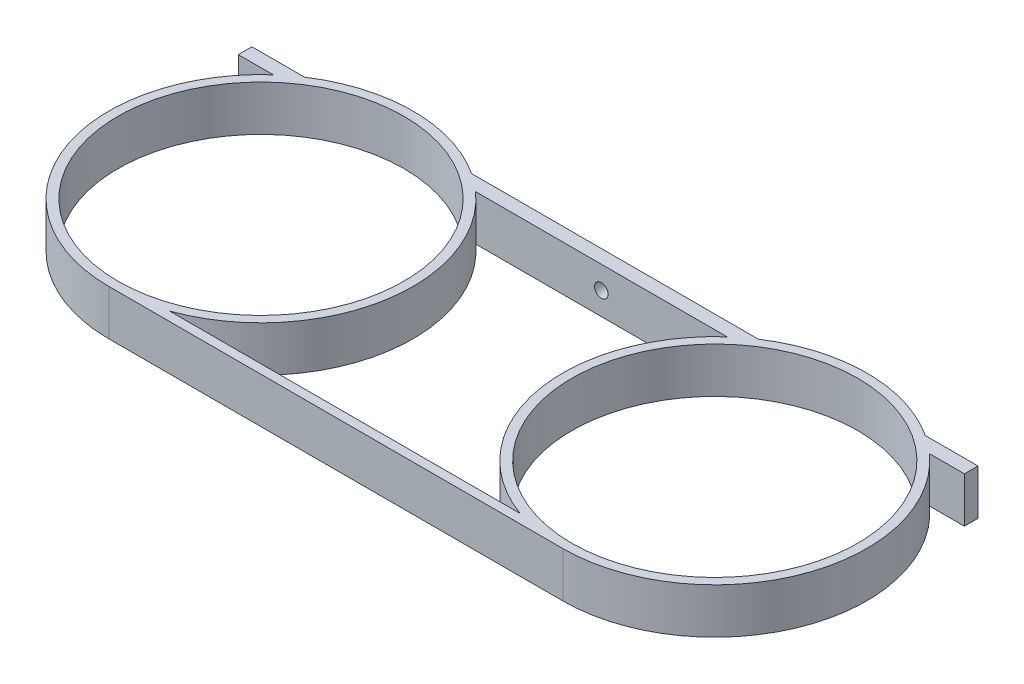
ISO-10303-21;
HEADER;
FILE_DESCRIPTION(('STEP AP214'),'2;1');
FILE_NAME('part.step','',(''),(''),'','','');
FILE_SCHEMA(('AUTOMOTIVE_DESIGN { 1 0 10303 214 1 1 1 1 }'));
ENDSEC;
DATA;
#1=APPLICATION_CONTEXT('core data for automotive mechanical design processes');
#2=APPLICATION_PROTOCOL_DEFINITION('international standard','automotive_design',2000,#1);
#3=PRODUCT_CONTEXT('',#1,'mechanical');
#4=PRODUCT('Part','Part','',(#3));
#5=PRODUCT_RELATED_PRODUCT_CATEGORY('part','',(#4));
#6=PRODUCT_DEFINITION_FORMATION('','',#4);
#7=PRODUCT_DEFINITION_CONTEXT('part definition',#1,'design');
#8=PRODUCT_DEFINITION('design','',#6,#7);
#9=PRODUCT_DEFINITION_SHAPE('','',#8);
#10=(LENGTH_UNIT() NAMED_UNIT(*) SI_UNIT(.MILLI.,.METRE.));
#11=(NAMED_UNIT(*) PLANE_ANGLE_UNIT() SI_UNIT($,.RADIAN.));
#12=(NAMED_UNIT(*) SI_UNIT($,.STERADIAN.) SOLID_ANGLE_UNIT());
#13=UNCERTAINTY_MEASURE_WITH_UNIT(LENGTH_MEASURE(1.E-05),#10,'distance_accuracy_value','');
#14=(GEOMETRIC_REPRESENTATION_CONTEXT(3) GLOBAL_UNCERTAINTY_ASSIGNED_CONTEXT((#13)) GLOBAL_UNIT_ASSIGNED_CONTEXT((#10,
#11,#12)) REPRESENTATION_CONTEXT('',''));
#15=CARTESIAN_POINT('',(0.,0.,0.));
#16=DIRECTION('',(0.,0.,1.));
#17=DIRECTION('',(1.,0.,0.));
#18=AXIS2_PLACEMENT_3D('',#15,#16,#17);
#19=CARTESIAN_POINT('',(0.,10.,0.));
#20=DIRECTION('',(0.,1.,0.));
#21=DIRECTION('',(0.,0.,1.));
#22=AXIS2_PLACEMENT_3D('',#19,#20,#21);
#23=PLANE('',#22);
#24=DIRECTION('',(-1.,0.,0.));
#25=VECTOR('',#24,1.);
#26=CARTESIAN_POINT('',(22.2991031209778,10.,-25.));
#27=LINE('',#26,#25);
#28=CARTESIAN_POINT('',(77.7008968790222,10.,-25.));
#29=VERTEX_POINT('',#28);
#30=CARTESIAN_POINT('',(22.2991031209778,10.,-25.));
#31=VERTEX_POINT('',#30);
#32=EDGE_CURVE('E155',#29,#31,#27,.T.);
#33=ORIENTED_EDGE('',*,*,#32,.F.);
#34=CARTESIAN_POINT('',(100.,10.,0.));
#35=DIRECTION('',(0.,-1.,0.));
#36=DIRECTION('',(0.,0.,1.));
#37=AXIS2_PLACEMENT_3D('',#34,#35,#36);
#38=CIRCLE('',#37,33.5);
#39=CARTESIAN_POINT('',(88.5982457490086,10.,31.5));
#40=VERTEX_POINT('',#39);
#41=EDGE_CURVE('E147',#40,#29,#38,.T.);
#42=ORIENTED_EDGE('',*,*,#41,.F.);
#43=DIRECTION('',(1.,0.,0.));
#44=VECTOR('',#43,1.);
#45=CARTESIAN_POINT('',(11.4017542509914,10.,31.5));
#46=LINE('',#45,#44);
#47=CARTESIAN_POINT('',(11.4017542509914,10.,31.5));
#48=VERTEX_POINT('',#47);
#49=EDGE_CURVE('E170',#48,#40,#46,.T.);
#50=ORIENTED_EDGE('',*,*,#49,.F.);
#51=CARTESIAN_POINT('',(0.,10.,0.));
#52=DIRECTION('',(0.,-1.,0.));
#53=DIRECTION('',(0.,0.,1.));
#54=AXIS2_PLACEMENT_3D('',#51,#52,#53);
#55=CIRCLE('',#54,33.5);
#56=EDGE_CURVE('E168',#31,#48,#55,.T.);
#57=ORIENTED_EDGE('',*,*,#56,.F.);
#58=EDGE_LOOP('',(#33,#42,#50,#57));
#59=FACE_BOUND('',#58,.T.);
#60=CARTESIAN_POINT('',(0.,10.,0.));
#61=DIRECTION('',(0.,1.,0.));
#62=DIRECTION('',(0.,0.,1.));
#63=AXIS2_PLACEMENT_3D('',#60,#61,#62);
#64=CIRCLE('',#63,31.5);
#65=CARTESIAN_POINT('',(0.,10.,31.5));
#66=VERTEX_POINT('',#65);
#67=EDGE_CURVE('E186',#66,#66,#64,.T.);
#68=ORIENTED_EDGE('',*,*,#67,.F.);
#69=EDGE_LOOP('',(#68));
#70=FACE_BOUND('',#69,.T.);
#71=DIRECTION('',(0.,0.,1.));
#72=VECTOR('',#71,1.);
#73=CARTESIAN_POINT('',(-30.,10.,-28.));
#74=LINE('',#73,#72);
#75=CARTESIAN_POINT('',(-30.,10.,-28.));
#76=VERTEX_POINT('',#75);
#77=CARTESIAN_POINT('',(-30.,10.,-25.));
#78=VERTEX_POINT('',#77);
#79=EDGE_CURVE('E192',#76,#78,#74,.T.);
#80=ORIENTED_EDGE('',*,*,#79,.T.);
#81=DIRECTION('',(1.,0.,0.));
#82=VECTOR('',#81,1.);
#83=CARTESIAN_POINT('',(-30.,10.,-25.));
#84=LINE('',#83,#82);
#85=CARTESIAN_POINT('',(-22.2991031209778,10.,-25.));
#86=VERTEX_POINT('',#85);
#87=EDGE_CURVE('E195',#78,#86,#84,.T.);
#88=ORIENTED_EDGE('',*,*,#87,.T.);
#89=CARTESIAN_POINT('',(0.,10.,0.));
#90=DIRECTION('',(0.,1.,0.));
#91=DIRECTION('',(0.,0.,1.));
#92=AXIS2_PLACEMENT_3D('',#89,#90,#91);
#93=CIRCLE('',#92,33.5);
#94=CARTESIAN_POINT('',(0.,10.,33.5));
#95=VERTEX_POINT('',#94);
#96=EDGE_CURVE('E198',#86,#95,#93,.T.);
#97=ORIENTED_EDGE('',*,*,#96,.T.);
#98=DIRECTION('',(1.,0.,0.));
#99=VECTOR('',#98,1.);
#100=CARTESIAN_POINT('',(0.,10.,33.5));
#101=LINE('',#100,#99);
#102=CARTESIAN_POINT('',(100.,10.,33.5));
#103=VERTEX_POINT('',#102);
#104=EDGE_CURVE('E200',#95,#103,#101,.T.);
#105=ORIENTED_EDGE('',*,*,#104,.T.);
#106=CARTESIAN_POINT('',(100.,10.,0.));
#107=DIRECTION('',(0.,1.,0.));
#108=DIRECTION('',(0.,0.,1.));
#109=AXIS2_PLACEMENT_3D('',#106,#107,#108);
#110=CIRCLE('',#109,33.5);
#111=CARTESIAN_POINT('',(122.299103120978,10.,-25.));
#112=VERTEX_POINT('',#111);
#113=EDGE_CURVE('E202',#103,#112,#110,.T.);
#114=ORIENTED_EDGE('',*,*,#113,.T.);
#115=DIRECTION('',(1.,0.,0.));
#116=VECTOR('',#115,1.);
#117=CARTESIAN_POINT('',(122.299103120978,10.,-25.));
#118=LINE('',#117,#116);
#119=CARTESIAN_POINT('',(130.,10.,-25.));
#120=VERTEX_POINT('',#119);
#121=EDGE_CURVE('E204',#112,#120,#118,.T.);
#122=ORIENTED_EDGE('',*,*,#121,.T.);
#123=DIRECTION('',(0.,0.,-1.));
#124=VECTOR('',#123,1.);
#125=CARTESIAN_POINT('',(130.,10.,-28.));
#126=LINE('',#125,#124);
#127=CARTESIAN_POINT('',(130.,10.,-28.));
#128=VERTEX_POINT('',#127);
#129=EDGE_CURVE('E206',#120,#128,#126,.T.);
#130=ORIENTED_EDGE('',*,*,#129,.T.);
#131=DIRECTION('',(-1.,0.,0.));
#132=VECTOR('',#131,1.);
#133=CARTESIAN_POINT('',(118.39157415775,10.,-28.));
#134=LINE('',#133,#132);
#135=CARTESIAN_POINT('',(118.39157415775,10.,-28.));
#136=VERTEX_POINT('',#135);
#137=EDGE_CURVE('E208',#128,#136,#134,.T.);
#138=ORIENTED_EDGE('',*,*,#137,.T.);
#139=CARTESIAN_POINT('',(100.,10.,0.));
#140=DIRECTION('',(0.,1.,0.));
#141=DIRECTION('',(0.,0.,1.));
#142=AXIS2_PLACEMENT_3D('',#139,#140,#141);
#143=CIRCLE('',#142,33.5);
#144=CARTESIAN_POINT('',(81.6084258422505,10.,-28.));
#145=VERTEX_POINT('',#144);
#146=EDGE_CURVE('E210',#136,#145,#143,.T.);
#147=ORIENTED_EDGE('',*,*,#146,.T.);
#148=DIRECTION('',(-1.,0.,0.));
#149=VECTOR('',#148,1.);
#150=CARTESIAN_POINT('',(18.3915741577495,10.,-28.));
#151=LINE('',#150,#149);
#152=CARTESIAN_POINT('',(18.3915741577495,10.,-28.));
#153=VERTEX_POINT('',#152);
#154=EDGE_CURVE('E212',#145,#153,#151,.T.);
#155=ORIENTED_EDGE('',*,*,#154,.T.);
#156=CARTESIAN_POINT('',(0.,10.,0.));
#157=DIRECTION('',(0.,1.,0.));
#158=DIRECTION('',(0.,0.,1.));
#159=AXIS2_PLACEMENT_3D('',#156,#157,#158);
#160=CIRCLE('',#159,33.5);
#161=CARTESIAN_POINT('',(-18.3915741577495,10.,-28.));
#162=VERTEX_POINT('',#161);
#163=EDGE_CURVE('E214',#153,#162,#160,.T.);
#164=ORIENTED_EDGE('',*,*,#163,.T.);
#165=DIRECTION('',(-1.,0.,0.));
#166=VECTOR('',#165,1.);
#167=CARTESIAN_POINT('',(-30.,10.,-28.));
#168=LINE('',#167,#166);
#169=EDGE_CURVE('E216',#162,#76,#168,.T.);
#170=ORIENTED_EDGE('',*,*,#169,.T.);
#171=EDGE_LOOP('',(#80,#88,#97,#105,#114,#122,#130,#138,#147,#155,#164,#170));
#172=FACE_BOUND('',#171,.T.);
#173=CARTESIAN_POINT('',(100.,10.,0.));
#174=DIRECTION('',(0.,1.,0.));
#175=DIRECTION('',(0.,0.,1.));
#176=AXIS2_PLACEMENT_3D('',#173,#174,#175);
#177=CIRCLE('',#176,31.5);
#178=CARTESIAN_POINT('',(100.,10.,31.5));
#179=VERTEX_POINT('',#178);
#180=EDGE_CURVE('E176',#179,#179,#177,.T.);
#181=ORIENTED_EDGE('',*,*,#180,.F.);
#182=EDGE_LOOP('',(#181));
#183=FACE_BOUND('',#182,.T.);
#184=ADVANCED_FACE('F33',(#59,#70,#172,#183),#23,.T.);
#185=CARTESIAN_POINT('',(0.,0.,0.));
#186=DIRECTION('',(0.,1.,0.));
#187=DIRECTION('',(0.,0.,1.));
#188=AXIS2_PLACEMENT_3D('',#185,#186,#187);
#189=PLANE('',#188);
#190=CARTESIAN_POINT('',(0.,0.,0.));
#191=DIRECTION('',(0.,1.,0.));
#192=DIRECTION('',(0.,0.,1.));
#193=AXIS2_PLACEMENT_3D('',#190,#191,#192);
#194=CIRCLE('',#193,31.5);
#195=CARTESIAN_POINT('',(0.,0.,31.5));
#196=VERTEX_POINT('',#195);
#197=EDGE_CURVE('E163',#196,#196,#194,.T.);
#198=ORIENTED_EDGE('',*,*,#197,.T.);
#199=EDGE_LOOP('',(#198));
#200=FACE_BOUND('',#199,.T.);
#201=DIRECTION('',(0.,0.,1.));
#202=VECTOR('',#201,1.);
#203=CARTESIAN_POINT('',(-30.,0.,-28.));
#204=LINE('',#203,#202);
#205=CARTESIAN_POINT('',(-30.,0.,-28.));
#206=VERTEX_POINT('',#205);
#207=CARTESIAN_POINT('',(-30.,0.,-25.));
#208=VERTEX_POINT('',#207);
#209=EDGE_CURVE('E189',#206,#208,#204,.T.);
#210=ORIENTED_EDGE('',*,*,#209,.F.);
#211=DIRECTION('',(-1.,0.,0.));
#212=VECTOR('',#211,1.);
#213=CARTESIAN_POINT('',(-30.,0.,-28.));
#214=LINE('',#213,#212);
#215=CARTESIAN_POINT('',(-18.3915741577495,0.,-28.));
#216=VERTEX_POINT('',#215);
#217=EDGE_CURVE('E196',#216,#206,#214,.T.);
#218=ORIENTED_EDGE('',*,*,#217,.F.);
#219=CARTESIAN_POINT('',(0.,0.,0.));
#220=DIRECTION('',(0.,1.,0.));
#221=DIRECTION('',(0.,0.,1.));
#222=AXIS2_PLACEMENT_3D('',#219,#220,#221);
#223=CIRCLE('',#222,33.5);
#224=CARTESIAN_POINT('',(18.3915741577495,0.,-28.));
#225=VERTEX_POINT('',#224);
#226=EDGE_CURVE('E239',#225,#216,#223,.T.);
#227=ORIENTED_EDGE('',*,*,#226,.F.);
#228=DIRECTION('',(-1.,0.,0.));
#229=VECTOR('',#228,1.);
#230=CARTESIAN_POINT('',(18.3915741577495,0.,-28.));
#231=LINE('',#230,#229);
#232=CARTESIAN_POINT('',(81.6084258422505,0.,-28.));
#233=VERTEX_POINT('',#232);
#234=EDGE_CURVE('E237',#233,#225,#231,.T.);
#235=ORIENTED_EDGE('',*,*,#234,.F.);
#236=CARTESIAN_POINT('',(100.,0.,0.));
#237=DIRECTION('',(0.,1.,0.));
#238=DIRECTION('',(0.,0.,1.));
#239=AXIS2_PLACEMENT_3D('',#236,#237,#238);
#240=CIRCLE('',#239,33.5);
#241=CARTESIAN_POINT('',(118.39157415775,0.,-28.));
#242=VERTEX_POINT('',#241);
#243=EDGE_CURVE('E235',#242,#233,#240,.T.);
#244=ORIENTED_EDGE('',*,*,#243,.F.);
#245=DIRECTION('',(-1.,0.,0.));
#246=VECTOR('',#245,1.);
#247=CARTESIAN_POINT('',(118.39157415775,0.,-28.));
#248=LINE('',#247,#246);
#249=CARTESIAN_POINT('',(130.,0.,-28.));
#250=VERTEX_POINT('',#249);
#251=EDGE_CURVE('E233',#250,#242,#248,.T.);
#252=ORIENTED_EDGE('',*,*,#251,.F.);
#253=DIRECTION('',(0.,0.,-1.));
#254=VECTOR('',#253,1.);
#255=CARTESIAN_POINT('',(130.,0.,-28.));
#256=LINE('',#255,#254);
#257=CARTESIAN_POINT('',(130.,0.,-25.));
#258=VERTEX_POINT('',#257);
#259=EDGE_CURVE('E231',#258,#250,#256,.T.);
#260=ORIENTED_EDGE('',*,*,#259,.F.);
#261=DIRECTION('',(1.,0.,0.));
#262=VECTOR('',#261,1.);
#263=CARTESIAN_POINT('',(122.299103120978,0.,-25.));
#264=LINE('',#263,#262);
#265=CARTESIAN_POINT('',(122.299103120978,0.,-25.));
#266=VERTEX_POINT('',#265);
#267=EDGE_CURVE('E229',#266,#258,#264,.T.);
#268=ORIENTED_EDGE('',*,*,#267,.F.);
#269=CARTESIAN_POINT('',(100.,0.,0.));
#270=DIRECTION('',(0.,1.,0.));
#271=DIRECTION('',(0.,0.,1.));
#272=AXIS2_PLACEMENT_3D('',#269,#270,#271);
#273=CIRCLE('',#272,33.5);
#274=CARTESIAN_POINT('',(100.,0.,33.5));
#275=VERTEX_POINT('',#274);
#276=EDGE_CURVE('E227',#275,#266,#273,.T.);
#277=ORIENTED_EDGE('',*,*,#276,.F.);
#278=DIRECTION('',(1.,0.,0.));
#279=VECTOR('',#278,1.);
#280=CARTESIAN_POINT('',(0.,0.,33.5));
#281=LINE('',#280,#279);
#282=CARTESIAN_POINT('',(0.,0.,33.5));
#283=VERTEX_POINT('',#282);
#284=EDGE_CURVE('E225',#283,#275,#281,.T.);
#285=ORIENTED_EDGE('',*,*,#284,.F.);
#286=CARTESIAN_POINT('',(0.,0.,0.));
#287=DIRECTION('',(0.,1.,0.));
#288=DIRECTION('',(0.,0.,1.));
#289=AXIS2_PLACEMENT_3D('',#286,#287,#288);
#290=CIRCLE('',#289,33.5);
#291=CARTESIAN_POINT('',(-22.2991031209778,0.,-25.));
#292=VERTEX_POINT('',#291);
#293=EDGE_CURVE('E223',#292,#283,#290,.T.);
#294=ORIENTED_EDGE('',*,*,#293,.F.);
#295=DIRECTION('',(1.,0.,0.));
#296=VECTOR('',#295,1.);
#297=CARTESIAN_POINT('',(-30.,0.,-25.));
#298=LINE('',#297,#296);
#299=EDGE_CURVE('E221',#208,#292,#298,.T.);
#300=ORIENTED_EDGE('',*,*,#299,.F.);
#301=EDGE_LOOP('',(#210,#218,#227,#235,#244,#252,#260,#268,#277,#285,#294,#300));
#302=FACE_BOUND('',#301,.T.);
#303=CARTESIAN_POINT('',(100.,0.,0.));
#304=DIRECTION('',(0.,-1.,0.));
#305=DIRECTION('',(0.,0.,1.));
#306=AXIS2_PLACEMENT_3D('',#303,#304,#305);
#307=CIRCLE('',#306,33.5);
#308=CARTESIAN_POINT('',(88.5982457490086,0.,31.5));
#309=VERTEX_POINT('',#308);
#310=CARTESIAN_POINT('',(77.7008968790222,0.,-25.));
#311=VERTEX_POINT('',#310);
#312=EDGE_CURVE('E57',#309,#311,#307,.T.);
#313=ORIENTED_EDGE('',*,*,#312,.T.);
#314=DIRECTION('',(-1.,0.,0.));
#315=VECTOR('',#314,1.);
#316=CARTESIAN_POINT('',(22.2991031209778,0.,-25.));
#317=LINE('',#316,#315);
#318=CARTESIAN_POINT('',(22.2991031209778,0.,-25.));
#319=VERTEX_POINT('',#318);
#320=EDGE_CURVE('E162',#311,#319,#317,.T.);
#321=ORIENTED_EDGE('',*,*,#320,.T.);
#322=CARTESIAN_POINT('',(0.,0.,0.));
#323=DIRECTION('',(0.,-1.,0.));
#324=DIRECTION('',(0.,0.,1.));
#325=AXIS2_PLACEMENT_3D('',#322,#323,#324);
#326=CIRCLE('',#325,33.5);
#327=CARTESIAN_POINT('',(11.4017542509914,0.,31.5));
#328=VERTEX_POINT('',#327);
#329=EDGE_CURVE('E178',#319,#328,#326,.T.);
#330=ORIENTED_EDGE('',*,*,#329,.T.);
#331=DIRECTION('',(1.,0.,0.));
#332=VECTOR('',#331,1.);
#333=CARTESIAN_POINT('',(11.4017542509914,0.,31.5));
#334=LINE('',#333,#332);
#335=EDGE_CURVE('E156',#328,#309,#334,.T.);
#336=ORIENTED_EDGE('',*,*,#335,.T.);
#337=EDGE_LOOP('',(#313,#321,#330,#336));
#338=FACE_BOUND('',#337,.T.);
#339=CARTESIAN_POINT('',(100.,0.,0.));
#340=DIRECTION('',(0.,1.,0.));
#341=DIRECTION('',(0.,0.,1.));
#342=AXIS2_PLACEMENT_3D('',#339,#340,#341);
#343=CIRCLE('',#342,31.5);
#344=CARTESIAN_POINT('',(100.,0.,31.5));
#345=VERTEX_POINT('',#344);
#346=EDGE_CURVE('E519',#345,#345,#343,.T.);
#347=ORIENTED_EDGE('',*,*,#346,.T.);
#348=EDGE_LOOP('',(#347));
#349=FACE_BOUND('',#348,.T.);
#350=ADVANCED_FACE('F282',(#200,#302,#338,#349),#189,.F.);
#351=CARTESIAN_POINT('',(-30.,10.,-28.));
#352=DIRECTION('',(1.,0.,0.));
#353=DIRECTION('',(0.,0.,-1.));
#354=AXIS2_PLACEMENT_3D('',#351,#352,#353);
#355=PLANE('',#354);
#356=ORIENTED_EDGE('',*,*,#209,.T.);
#357=DIRECTION('',(0.,-1.,0.));
#358=VECTOR('',#357,1.);
#359=CARTESIAN_POINT('',(-30.,10.,-25.));
#360=LINE('',#359,#358);
#361=EDGE_CURVE('E11',#78,#208,#360,.T.);
#362=ORIENTED_EDGE('',*,*,#361,.F.);
#363=ORIENTED_EDGE('',*,*,#79,.F.);
#364=DIRECTION('',(0.,-1.,0.));
#365=VECTOR('',#364,1.);
#366=CARTESIAN_POINT('',(-30.,10.,-28.));
#367=LINE('',#366,#365);
#368=EDGE_CURVE('E218',#76,#206,#367,.T.);
#369=ORIENTED_EDGE('',*,*,#368,.T.);
#370=EDGE_LOOP('',(#356,#362,#363,#369));
#371=FACE_BOUND('',#370,.T.);
#372=ADVANCED_FACE('F35',(#371),#355,.F.);
#373=CARTESIAN_POINT('',(-30.,10.,-25.));
#374=DIRECTION('',(0.,0.,-1.));
#375=DIRECTION('',(-1.,0.,0.));
#376=AXIS2_PLACEMENT_3D('',#373,#374,#375);
#377=PLANE('',#376);
#378=ORIENTED_EDGE('',*,*,#299,.T.);
#379=DIRECTION('',(0.,-1.,0.));
#380=VECTOR('',#379,1.);
#381=CARTESIAN_POINT('',(-22.2991031209778,10.,-25.));
#382=LINE('',#381,#380);
#383=EDGE_CURVE('E42',#86,#292,#382,.T.);
#384=ORIENTED_EDGE('',*,*,#383,.F.);
#385=ORIENTED_EDGE('',*,*,#87,.F.);
#386=ORIENTED_EDGE('',*,*,#361,.T.);
#387=EDGE_LOOP('',(#378,#384,#385,#386));
#388=FACE_BOUND('',#387,.T.);
#389=ADVANCED_FACE('F300',(#388),#377,.F.);
#390=CARTESIAN_POINT('',(0.,10.,0.));
#391=DIRECTION('',(0.,-1.,0.));
#392=DIRECTION('',(0.,0.,-1.));
#393=AXIS2_PLACEMENT_3D('',#390,#391,#392);
#394=CYLINDRICAL_SURFACE('',#393,33.5);
#395=ORIENTED_EDGE('',*,*,#293,.T.);
#396=DIRECTION('',(0.,-1.,0.));
#397=VECTOR('',#396,1.);
#398=CARTESIAN_POINT('',(0.,10.,33.5));
#399=LINE('',#398,#397);
#400=EDGE_CURVE('E268',#95,#283,#399,.T.);
#401=ORIENTED_EDGE('',*,*,#400,.F.);
#402=ORIENTED_EDGE('',*,*,#96,.F.);
#403=ORIENTED_EDGE('',*,*,#383,.T.);
#404=EDGE_LOOP('',(#395,#401,#402,#403));
#405=FACE_BOUND('',#404,.T.);
#406=ADVANCED_FACE('F276',(#405),#394,.T.);
#407=CARTESIAN_POINT('',(0.,10.,33.5));
#408=DIRECTION('',(0.,0.,-1.));
#409=DIRECTION('',(-1.,0.,0.));
#410=AXIS2_PLACEMENT_3D('',#407,#408,#409);
#411=PLANE('',#410);
#412=ORIENTED_EDGE('',*,*,#284,.T.);
#413=DIRECTION('',(0.,-1.,0.));
#414=VECTOR('',#413,1.);
#415=CARTESIAN_POINT('',(100.,10.,33.5));
#416=LINE('',#415,#414);
#417=EDGE_CURVE('E265',#103,#275,#416,.T.);
#418=ORIENTED_EDGE('',*,*,#417,.F.);
#419=ORIENTED_EDGE('',*,*,#104,.F.);
#420=ORIENTED_EDGE('',*,*,#400,.T.);
#421=EDGE_LOOP('',(#412,#418,#419,#420));
#422=FACE_BOUND('',#421,.T.);
#423=ADVANCED_FACE('F288',(#422),#411,.F.);
#424=CARTESIAN_POINT('',(100.,10.,0.));
#425=DIRECTION('',(0.,-1.,0.));
#426=DIRECTION('',(0.,0.,-1.));
#427=AXIS2_PLACEMENT_3D('',#424,#425,#426);
#428=CYLINDRICAL_SURFACE('',#427,33.5);
#429=ORIENTED_EDGE('',*,*,#276,.T.);
#430=DIRECTION('',(0.,-1.,0.));
#431=VECTOR('',#430,1.);
#432=CARTESIAN_POINT('',(122.299103120978,10.,-25.));
#433=LINE('',#432,#431);
#434=EDGE_CURVE('E262',#112,#266,#433,.T.);
#435=ORIENTED_EDGE('',*,*,#434,.F.);
#436=ORIENTED_EDGE('',*,*,#113,.F.);
#437=ORIENTED_EDGE('',*,*,#417,.T.);
#438=EDGE_LOOP('',(#429,#435,#436,#437));
#439=FACE_BOUND('',#438,.T.);
#440=ADVANCED_FACE('F292',(#439),#428,.T.);
#441=CARTESIAN_POINT('',(122.299103120978,10.,-25.));
#442=DIRECTION('',(0.,0.,-1.));
#443=DIRECTION('',(-1.,0.,0.));
#444=AXIS2_PLACEMENT_3D('',#441,#442,#443);
#445=PLANE('',#444);
#446=ORIENTED_EDGE('',*,*,#267,.T.);
#447=DIRECTION('',(0.,-1.,0.));
#448=VECTOR('',#447,1.);
#449=CARTESIAN_POINT('',(130.,10.,-25.));
#450=LINE('',#449,#448);
#451=EDGE_CURVE('E259',#120,#258,#450,.T.);
#452=ORIENTED_EDGE('',*,*,#451,.F.);
#453=ORIENTED_EDGE('',*,*,#121,.F.);
#454=ORIENTED_EDGE('',*,*,#434,.T.);
#455=EDGE_LOOP('',(#446,#452,#453,#454));
#456=FACE_BOUND('',#455,.T.);
#457=ADVANCED_FACE('F333',(#456),#445,.F.);
#458=CARTESIAN_POINT('',(130.,10.,-28.));
#459=DIRECTION('',(-1.,0.,0.));
#460=DIRECTION('',(0.,0.,1.));
#461=AXIS2_PLACEMENT_3D('',#458,#459,#460);
#462=PLANE('',#461);
#463=ORIENTED_EDGE('',*,*,#259,.T.);
#464=DIRECTION('',(0.,-1.,0.));
#465=VECTOR('',#464,1.);
#466=CARTESIAN_POINT('',(130.,10.,-28.));
#467=LINE('',#466,#465);
#468=EDGE_CURVE('E256',#128,#250,#467,.T.);
#469=ORIENTED_EDGE('',*,*,#468,.F.);
#470=ORIENTED_EDGE('',*,*,#129,.F.);
#471=ORIENTED_EDGE('',*,*,#451,.T.);
#472=EDGE_LOOP('',(#463,#469,#470,#471));
#473=FACE_BOUND('',#472,.T.);
#474=ADVANCED_FACE('F331',(#473),#462,.F.);
#475=CARTESIAN_POINT('',(118.39157415775,10.,-28.));
#476=DIRECTION('',(0.,0.,1.));
#477=DIRECTION('',(1.,0.,0.));
#478=AXIS2_PLACEMENT_3D('',#475,#476,#477);
#479=PLANE('',#478);
#480=ORIENTED_EDGE('',*,*,#251,.T.);
#481=DIRECTION('',(0.,-1.,0.));
#482=VECTOR('',#481,1.);
#483=CARTESIAN_POINT('',(118.39157415775,10.,-28.));
#484=LINE('',#483,#482);
#485=EDGE_CURVE('E253',#136,#242,#484,.T.);
#486=ORIENTED_EDGE('',*,*,#485,.F.);
#487=ORIENTED_EDGE('',*,*,#137,.F.);
#488=ORIENTED_EDGE('',*,*,#468,.T.);
#489=EDGE_LOOP('',(#480,#486,#487,#488));
#490=FACE_BOUND('',#489,.T.);
#491=ADVANCED_FACE('F327',(#490),#479,.F.);
#492=CARTESIAN_POINT('',(100.,10.,0.));
#493=DIRECTION('',(0.,-1.,0.));
#494=DIRECTION('',(0.,0.,-1.));
#495=AXIS2_PLACEMENT_3D('',#492,#493,#494);
#496=CYLINDRICAL_SURFACE('',#495,33.5);
#497=ORIENTED_EDGE('',*,*,#243,.T.);
#498=DIRECTION('',(0.,-1.,0.));
#499=VECTOR('',#498,1.);
#500=CARTESIAN_POINT('',(81.6084258422505,10.,-28.));
#501=LINE('',#500,#499);
#502=EDGE_CURVE('E250',#145,#233,#501,.T.);
#503=ORIENTED_EDGE('',*,*,#502,.F.);
#504=ORIENTED_EDGE('',*,*,#146,.F.);
#505=ORIENTED_EDGE('',*,*,#485,.T.);
#506=EDGE_LOOP('',(#497,#503,#504,#505));
#507=FACE_BOUND('',#506,.T.);
#508=ADVANCED_FACE('F322',(#507),#496,.T.);
#509=CARTESIAN_POINT('',(18.3915741577495,10.,-28.));
#510=DIRECTION('',(0.,0.,1.));
#511=DIRECTION('',(1.,0.,0.));
#512=AXIS2_PLACEMENT_3D('',#509,#510,#511);
#513=PLANE('',#512);
#514=CARTESIAN_POINT('',(50.,5.00000000000001,-28.));
#515=DIRECTION('',(0.,0.,-1.));
#516=DIRECTION('',(-1.,0.,0.));
#517=AXIS2_PLACEMENT_3D('',#514,#515,#516);
#518=CIRCLE('',#517,1.5);
#519=CARTESIAN_POINT('',(48.5,5.00000000000001,-28.));
#520=VERTEX_POINT('',#519);
#521=EDGE_CURVE('E517',#520,#520,#518,.T.);
#522=ORIENTED_EDGE('',*,*,#521,.F.);
#523=EDGE_LOOP('',(#522));
#524=FACE_BOUND('',#523,.T.);
#525=ORIENTED_EDGE('',*,*,#234,.T.);
#526=DIRECTION('',(0.,-1.,0.));
#527=VECTOR('',#526,1.);
#528=CARTESIAN_POINT('',(18.3915741577495,10.,-28.));
#529=LINE('',#528,#527);
#530=EDGE_CURVE('E247',#153,#225,#529,.T.);
#531=ORIENTED_EDGE('',*,*,#530,.F.);
#532=ORIENTED_EDGE('',*,*,#154,.F.);
#533=ORIENTED_EDGE('',*,*,#502,.T.);
#534=EDGE_LOOP('',(#525,#531,#532,#533));
#535=FACE_BOUND('',#534,.T.);
#536=ADVANCED_FACE('F316',(#524,#535),#513,.F.);
#537=CARTESIAN_POINT('',(0.,10.,0.));
#538=DIRECTION('',(0.,-1.,0.));
#539=DIRECTION('',(0.,0.,-1.));
#540=AXIS2_PLACEMENT_3D('',#537,#538,#539);
#541=CYLINDRICAL_SURFACE('',#540,33.5);
#542=ORIENTED_EDGE('',*,*,#226,.T.);
#543=DIRECTION('',(0.,-1.,0.));
#544=VECTOR('',#543,1.);
#545=CARTESIAN_POINT('',(-18.3915741577495,10.,-28.));
#546=LINE('',#545,#544);
#547=EDGE_CURVE('E244',#162,#216,#546,.T.);
#548=ORIENTED_EDGE('',*,*,#547,.F.);
#549=ORIENTED_EDGE('',*,*,#163,.F.);
#550=ORIENTED_EDGE('',*,*,#530,.T.);
#551=EDGE_LOOP('',(#542,#548,#549,#550));
#552=FACE_BOUND('',#551,.T.);
#553=ADVANCED_FACE('F312',(#552),#541,.T.);
#554=CARTESIAN_POINT('',(-30.,10.,-28.));
#555=DIRECTION('',(0.,0.,1.));
#556=DIRECTION('',(1.,0.,0.));
#557=AXIS2_PLACEMENT_3D('',#554,#555,#556);
#558=PLANE('',#557);
#559=ORIENTED_EDGE('',*,*,#217,.T.);
#560=ORIENTED_EDGE('',*,*,#368,.F.);
#561=ORIENTED_EDGE('',*,*,#169,.F.);
#562=ORIENTED_EDGE('',*,*,#547,.T.);
#563=EDGE_LOOP('',(#559,#560,#561,#562));
#564=FACE_BOUND('',#563,.T.);
#565=ADVANCED_FACE('F307',(#564),#558,.F.);
#566=CARTESIAN_POINT('',(0.,10.,0.));
#567=DIRECTION('',(0.,-1.,0.));
#568=DIRECTION('',(0.,0.,-1.));
#569=AXIS2_PLACEMENT_3D('',#566,#567,#568);
#570=CYLINDRICAL_SURFACE('',#569,31.5);
#571=ORIENTED_EDGE('',*,*,#67,.T.);
#572=EDGE_LOOP('',(#571));
#573=FACE_BOUND('',#572,.T.);
#574=ORIENTED_EDGE('',*,*,#197,.F.);
#575=EDGE_LOOP('',(#574));
#576=FACE_BOUND('',#575,.T.);
#577=ADVANCED_FACE('F350',(#573,#576),#570,.F.);
#578=CARTESIAN_POINT('',(100.,10.,0.));
#579=DIRECTION('',(0.,-1.,0.));
#580=DIRECTION('',(0.,0.,-1.));
#581=AXIS2_PLACEMENT_3D('',#578,#579,#580);
#582=CYLINDRICAL_SURFACE('',#581,33.5);
#583=ORIENTED_EDGE('',*,*,#312,.F.);
#584=DIRECTION('',(0.,-1.,0.));
#585=VECTOR('',#584,1.);
#586=CARTESIAN_POINT('',(88.5982457490086,10.,31.5));
#587=LINE('',#586,#585);
#588=EDGE_CURVE('E151',#40,#309,#587,.T.);
#589=ORIENTED_EDGE('',*,*,#588,.F.);
#590=ORIENTED_EDGE('',*,*,#41,.T.);
#591=DIRECTION('',(0.,-1.,0.));
#592=VECTOR('',#591,1.);
#593=CARTESIAN_POINT('',(77.7008968790222,10.,-25.));
#594=LINE('',#593,#592);
#595=EDGE_CURVE('E150',#29,#311,#594,.T.);
#596=ORIENTED_EDGE('',*,*,#595,.T.);
#597=EDGE_LOOP('',(#583,#589,#590,#596));
#598=FACE_BOUND('',#597,.T.);
#599=ADVANCED_FACE('F149',(#598),#582,.T.);
#600=CARTESIAN_POINT('',(22.2991031209778,10.,-25.));
#601=DIRECTION('',(0.,0.,1.));
#602=DIRECTION('',(1.,0.,0.));
#603=AXIS2_PLACEMENT_3D('',#600,#601,#602);
#604=PLANE('',#603);
#605=CARTESIAN_POINT('',(50.,5.00000000000001,-25.));
#606=DIRECTION('',(0.,0.,1.));
#607=DIRECTION('',(1.,0.,0.));
#608=AXIS2_PLACEMENT_3D('',#605,#606,#607);
#609=CIRCLE('',#608,1.5);
#610=CARTESIAN_POINT('',(51.5,5.00000000000001,-25.));
#611=VERTEX_POINT('',#610);
#612=EDGE_CURVE('E37',#611,#611,#609,.T.);
#613=ORIENTED_EDGE('',*,*,#612,.F.);
#614=EDGE_LOOP('',(#613));
#615=FACE_BOUND('',#614,.T.);
#616=ORIENTED_EDGE('',*,*,#320,.F.);
#617=ORIENTED_EDGE('',*,*,#595,.F.);
#618=ORIENTED_EDGE('',*,*,#32,.T.);
#619=DIRECTION('',(0.,-1.,0.));
#620=VECTOR('',#619,1.);
#621=CARTESIAN_POINT('',(22.2991031209778,10.,-25.));
#622=LINE('',#621,#620);
#623=EDGE_CURVE('E164',#31,#319,#622,.T.);
#624=ORIENTED_EDGE('',*,*,#623,.T.);
#625=EDGE_LOOP('',(#616,#617,#618,#624));
#626=FACE_BOUND('',#625,.T.);
#627=ADVANCED_FACE('F159',(#615,#626),#604,.T.);
#628=CARTESIAN_POINT('',(0.,10.,0.));
#629=DIRECTION('',(0.,-1.,0.));
#630=DIRECTION('',(0.,0.,-1.));
#631=AXIS2_PLACEMENT_3D('',#628,#629,#630);
#632=CYLINDRICAL_SURFACE('',#631,33.5);
#633=ORIENTED_EDGE('',*,*,#329,.F.);
#634=ORIENTED_EDGE('',*,*,#623,.F.);
#635=ORIENTED_EDGE('',*,*,#56,.T.);
#636=DIRECTION('',(0.,-1.,0.));
#637=VECTOR('',#636,1.);
#638=CARTESIAN_POINT('',(11.4017542509914,10.,31.5));
#639=LINE('',#638,#637);
#640=EDGE_CURVE('E49',#48,#328,#639,.T.);
#641=ORIENTED_EDGE('',*,*,#640,.T.);
#642=EDGE_LOOP('',(#633,#634,#635,#641));
#643=FACE_BOUND('',#642,.T.);
#644=ADVANCED_FACE('F402',(#643),#632,.T.);
#645=CARTESIAN_POINT('',(11.4017542509914,10.,31.5));
#646=DIRECTION('',(0.,0.,-1.));
#647=DIRECTION('',(-1.,0.,0.));
#648=AXIS2_PLACEMENT_3D('',#645,#646,#647);
#649=PLANE('',#648);
#650=ORIENTED_EDGE('',*,*,#335,.F.);
#651=ORIENTED_EDGE('',*,*,#640,.F.);
#652=ORIENTED_EDGE('',*,*,#49,.T.);
#653=ORIENTED_EDGE('',*,*,#588,.T.);
#654=EDGE_LOOP('',(#650,#651,#652,#653));
#655=FACE_BOUND('',#654,.T.);
#656=ADVANCED_FACE('F410',(#655),#649,.T.);
#657=CARTESIAN_POINT('',(100.,10.,0.));
#658=DIRECTION('',(0.,-1.,0.));
#659=DIRECTION('',(0.,0.,-1.));
#660=AXIS2_PLACEMENT_3D('',#657,#658,#659);
#661=CYLINDRICAL_SURFACE('',#660,31.5);
#662=ORIENTED_EDGE('',*,*,#180,.T.);
#663=EDGE_LOOP('',(#662));
#664=FACE_BOUND('',#663,.T.);
#665=ORIENTED_EDGE('',*,*,#346,.F.);
#666=EDGE_LOOP('',(#665));
#667=FACE_BOUND('',#666,.T.);
#668=ADVANCED_FACE('F418',(#664,#667),#661,.F.);
#669=CARTESIAN_POINT('',(50.,5.00000000000001,-6.));
#670=DIRECTION('',(0.,0.,-1.));
#671=DIRECTION('',(-1.,0.,0.));
#672=AXIS2_PLACEMENT_3D('',#669,#670,#671);
#673=CYLINDRICAL_SURFACE('',#672,1.5);
#674=ORIENTED_EDGE('',*,*,#612,.T.);
#675=EDGE_LOOP('',(#674));
#676=FACE_BOUND('',#675,.T.);
#677=ORIENTED_EDGE('',*,*,#521,.T.);
#678=EDGE_LOOP('',(#677));
#679=FACE_BOUND('',#678,.T.);
#680=ADVANCED_FACE('F424',(#676,#679),#673,.F.);
#681=CLOSED_SHELL('',(#184,#350,#372,#389,#406,#423,#440,#457,#474,#491,#508,#536,#553,#565,
#577,#599,#627,#644,#656,#668,#680));
#682=MANIFOLD_SOLID_BREP('B2',#681);
#683=ADVANCED_BREP_SHAPE_REPRESENTATION('',(#18,#682),#14);
#684=SHAPE_DEFINITION_REPRESENTATION(#9,#683);
ENDSEC;
END-ISO-10303-21;
